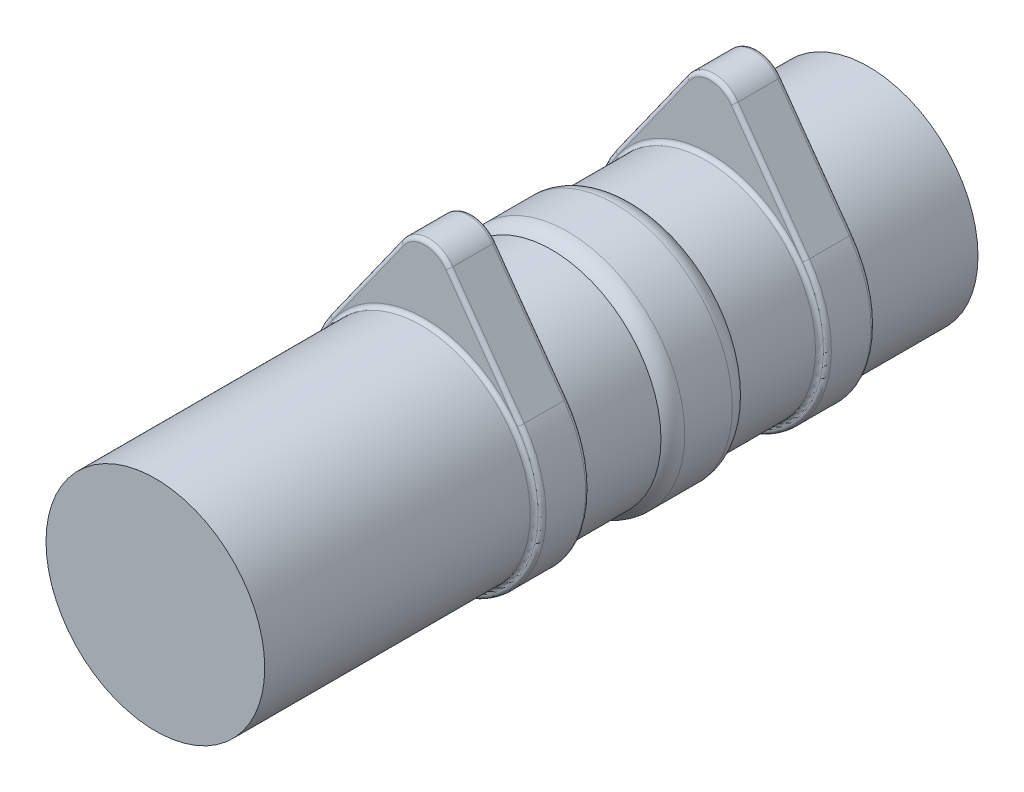
ISO-10303-21;
HEADER;
FILE_DESCRIPTION(('STEP AP214'),'2;1');
FILE_NAME('part.step','',(''),(''),'','','');
FILE_SCHEMA(('AUTOMOTIVE_DESIGN { 1 0 10303 214 1 1 1 1 }'));
ENDSEC;
DATA;
#1=APPLICATION_CONTEXT('core data for automotive mechanical design processes');
#2=APPLICATION_PROTOCOL_DEFINITION('international standard','automotive_design',2000,#1);
#3=PRODUCT_CONTEXT('',#1,'mechanical');
#4=PRODUCT('Part','Part','',(#3));
#5=PRODUCT_RELATED_PRODUCT_CATEGORY('part','',(#4));
#6=PRODUCT_DEFINITION_FORMATION('','',#4);
#7=PRODUCT_DEFINITION_CONTEXT('part definition',#1,'design');
#8=PRODUCT_DEFINITION('design','',#6,#7);
#9=PRODUCT_DEFINITION_SHAPE('','',#8);
#10=(LENGTH_UNIT() NAMED_UNIT(*) SI_UNIT(.MILLI.,.METRE.));
#11=(NAMED_UNIT(*) PLANE_ANGLE_UNIT() SI_UNIT($,.RADIAN.));
#12=(NAMED_UNIT(*) SI_UNIT($,.STERADIAN.) SOLID_ANGLE_UNIT());
#13=UNCERTAINTY_MEASURE_WITH_UNIT(LENGTH_MEASURE(1.E-05),#10,'distance_accuracy_value','');
#14=(GEOMETRIC_REPRESENTATION_CONTEXT(3) GLOBAL_UNCERTAINTY_ASSIGNED_CONTEXT((#13)) GLOBAL_UNIT_ASSIGNED_CONTEXT((#10,
#11,#12)) REPRESENTATION_CONTEXT('',''));
#15=CARTESIAN_POINT('',(0.,0.,0.));
#16=DIRECTION('',(0.,0.,1.));
#17=DIRECTION('',(1.,0.,0.));
#18=AXIS2_PLACEMENT_3D('',#15,#16,#17);
#19=CARTESIAN_POINT('',(0.,0.,-34.));
#20=DIRECTION('',(0.,0.,1.));
#21=DIRECTION('',(1.,0.,0.));
#22=AXIS2_PLACEMENT_3D('',#19,#20,#21);
#23=CYLINDRICAL_SURFACE('',#22,13.8);
#24=CARTESIAN_POINT('',(0.,0.,-33.5));
#25=DIRECTION('',(0.,0.,-1.));
#26=DIRECTION('',(-1.,0.,0.));
#27=AXIS2_PLACEMENT_3D('',#24,#25,#26);
#28=CIRCLE('',#27,13.8);
#29=CARTESIAN_POINT('',(-13.8,0.,-33.5));
#30=VERTEX_POINT('',#29);
#31=EDGE_CURVE('E261',#30,#30,#28,.F.);
#32=ORIENTED_EDGE('',*,*,#31,.T.);
#33=EDGE_LOOP('',(#32));
#34=FACE_BOUND('',#33,.T.);
#35=CARTESIAN_POINT('',(0.,0.,0.));
#36=DIRECTION('',(0.,0.,1.));
#37=DIRECTION('',(1.,0.,0.));
#38=AXIS2_PLACEMENT_3D('',#35,#36,#37);
#39=CIRCLE('',#38,13.8);
#40=CARTESIAN_POINT('',(13.8,0.,0.));
#41=VERTEX_POINT('',#40);
#42=EDGE_CURVE('E357',#41,#41,#39,.T.);
#43=ORIENTED_EDGE('',*,*,#42,.F.);
#44=EDGE_LOOP('',(#43));
#45=FACE_BOUND('',#44,.T.);
#46=ADVANCED_FACE('F39',(#34,#45),#23,.T.);
#47=CARTESIAN_POINT('',(0.,0.,0.));
#48=DIRECTION('',(0.,0.,1.));
#49=DIRECTION('',(1.,0.,0.));
#50=AXIS2_PLACEMENT_3D('',#47,#48,#49);
#51=PLANE('',#50);
#52=ORIENTED_EDGE('',*,*,#42,.T.);
#53=EDGE_LOOP('',(#52));
#54=FACE_BOUND('',#53,.T.);
#55=ADVANCED_FACE('F441',(#54),#51,.T.);
#56=CARTESIAN_POINT('',(0.,19.05,-40.));
#57=DIRECTION('',(0.,0.,1.));
#58=DIRECTION('',(1.,0.,0.));
#59=AXIS2_PLACEMENT_3D('',#56,#57,#58);
#60=CYLINDRICAL_SURFACE('',#59,3.75);
#61=DIRECTION('',(0.,0.,1.));
#62=VECTOR('',#61,1.);
#63=CARTESIAN_POINT('',(3.05467161279855,21.2251968503937,-40.));
#64=LINE('',#63,#62);
#65=CARTESIAN_POINT('',(3.05467161279855,21.2251968503937,-39.5));
#66=VERTEX_POINT('',#65);
#67=CARTESIAN_POINT('',(3.05467161279855,21.2251968503937,-34.5));
#68=VERTEX_POINT('',#67);
#69=EDGE_CURVE('E348',#66,#68,#64,.T.);
#70=ORIENTED_EDGE('',*,*,#69,.F.);
#71=CARTESIAN_POINT('',(0.,19.05,-39.5));
#72=DIRECTION('',(0.,0.,-1.));
#73=DIRECTION('',(-1.,0.,0.));
#74=AXIS2_PLACEMENT_3D('',#71,#72,#73);
#75=CIRCLE('',#74,3.75);
#76=CARTESIAN_POINT('',(-3.05467161279855,21.2251968503937,-39.5));
#77=VERTEX_POINT('',#76);
#78=EDGE_CURVE('E385',#66,#77,#75,.F.);
#79=ORIENTED_EDGE('',*,*,#78,.T.);
#80=DIRECTION('',(0.,0.,1.));
#81=VECTOR('',#80,1.);
#82=CARTESIAN_POINT('',(-3.05467161279855,21.2251968503937,-40.));
#83=LINE('',#82,#81);
#84=CARTESIAN_POINT('',(-3.05467161279855,21.2251968503937,-34.5));
#85=VERTEX_POINT('',#84);
#86=EDGE_CURVE('E337',#77,#85,#83,.T.);
#87=ORIENTED_EDGE('',*,*,#86,.T.);
#88=CARTESIAN_POINT('',(0.,19.05,-34.5));
#89=DIRECTION('',(0.,0.,-1.));
#90=DIRECTION('',(-1.,0.,0.));
#91=AXIS2_PLACEMENT_3D('',#88,#89,#90);
#92=CIRCLE('',#91,3.75);
#93=EDGE_CURVE('E382',#85,#68,#92,.T.);
#94=ORIENTED_EDGE('',*,*,#93,.T.);
#95=EDGE_LOOP('',(#70,#79,#87,#94));
#96=FACE_BOUND('',#95,.T.);
#97=ADVANCED_FACE('F419',(#96),#60,.T.);
#98=CARTESIAN_POINT('',(3.05467161279855,21.2251968503937,-40.));
#99=DIRECTION('',(-0.814579096746281,-0.58005249343832,0.));
#100=DIRECTION('',(0.58005249343832,-0.814579096746281,0.));
#101=AXIS2_PLACEMENT_3D('',#98,#99,#100);
#102=PLANE('',#101);
#103=DIRECTION('',(0.,0.,1.));
#104=VECTOR('',#103,1.);
#105=CARTESIAN_POINT('',(12.055770631845,8.58477690288714,-40.));
#106=LINE('',#105,#104);
#107=CARTESIAN_POINT('',(12.055770631845,8.58477690288714,-39.5));
#108=VERTEX_POINT('',#107);
#109=CARTESIAN_POINT('',(12.055770631845,8.58477690288714,-34.5));
#110=VERTEX_POINT('',#109);
#111=EDGE_CURVE('E344',#108,#110,#106,.T.);
#112=ORIENTED_EDGE('',*,*,#111,.F.);
#113=DIRECTION('',(0.58005249343832,-0.814579096746281,0.));
#114=VECTOR('',#113,1.);
#115=CARTESIAN_POINT('',(3.05467161279855,21.2251968503937,-39.5));
#116=LINE('',#115,#114);
#117=EDGE_CURVE('E179',#108,#66,#116,.F.);
#118=ORIENTED_EDGE('',*,*,#117,.T.);
#119=ORIENTED_EDGE('',*,*,#69,.T.);
#120=DIRECTION('',(0.58005249343832,-0.814579096746281,0.));
#121=VECTOR('',#120,1.);
#122=CARTESIAN_POINT('',(3.05467161279855,21.2251968503937,-34.5));
#123=LINE('',#122,#121);
#124=EDGE_CURVE('E327',#68,#110,#123,.T.);
#125=ORIENTED_EDGE('',*,*,#124,.T.);
#126=EDGE_LOOP('',(#112,#118,#119,#125));
#127=FACE_BOUND('',#126,.T.);
#128=ADVANCED_FACE('F421',(#127),#102,.F.);
#129=CARTESIAN_POINT('',(0.,0.,-40.));
#130=DIRECTION('',(0.,0.,1.));
#131=DIRECTION('',(1.,0.,0.));
#132=AXIS2_PLACEMENT_3D('',#129,#130,#131);
#133=CYLINDRICAL_SURFACE('',#132,14.8);
#134=DIRECTION('',(0.,0.,1.));
#135=VECTOR('',#134,1.);
#136=CARTESIAN_POINT('',(-12.055770631845,8.58477690288714,-40.));
#137=LINE('',#136,#135);
#138=CARTESIAN_POINT('',(-12.055770631845,8.58477690288714,-39.5));
#139=VERTEX_POINT('',#138);
#140=CARTESIAN_POINT('',(-12.055770631845,8.58477690288714,-34.5));
#141=VERTEX_POINT('',#140);
#142=EDGE_CURVE('E334',#139,#141,#137,.T.);
#143=ORIENTED_EDGE('',*,*,#142,.F.);
#144=CARTESIAN_POINT('',(0.,0.,-39.5));
#145=DIRECTION('',(0.,0.,-1.));
#146=DIRECTION('',(-1.,0.,0.));
#147=AXIS2_PLACEMENT_3D('',#144,#145,#146);
#148=CIRCLE('',#147,14.8);
#149=EDGE_CURVE('E321',#139,#108,#148,.F.);
#150=ORIENTED_EDGE('',*,*,#149,.T.);
#151=ORIENTED_EDGE('',*,*,#111,.T.);
#152=CARTESIAN_POINT('',(0.,0.,-34.5));
#153=DIRECTION('',(0.,0.,-1.));
#154=DIRECTION('',(-1.,0.,0.));
#155=AXIS2_PLACEMENT_3D('',#152,#153,#154);
#156=CIRCLE('',#155,14.8);
#157=EDGE_CURVE('E328',#110,#141,#156,.T.);
#158=ORIENTED_EDGE('',*,*,#157,.T.);
#159=EDGE_LOOP('',(#143,#150,#151,#158));
#160=FACE_BOUND('',#159,.T.);
#161=ADVANCED_FACE('F341',(#160),#133,.T.);
#162=CARTESIAN_POINT('',(-3.05467161279855,21.2251968503937,-40.));
#163=DIRECTION('',(0.814579096746281,-0.58005249343832,0.));
#164=DIRECTION('',(0.580052493438321,0.814579096746281,0.));
#165=AXIS2_PLACEMENT_3D('',#162,#163,#164);
#166=PLANE('',#165);
#167=ORIENTED_EDGE('',*,*,#86,.F.);
#168=DIRECTION('',(0.580052493438321,0.814579096746281,0.));
#169=VECTOR('',#168,1.);
#170=CARTESIAN_POINT('',(-12.055770631845,8.58477690288714,-39.5));
#171=LINE('',#170,#169);
#172=EDGE_CURVE('E319',#77,#139,#171,.F.);
#173=ORIENTED_EDGE('',*,*,#172,.T.);
#174=ORIENTED_EDGE('',*,*,#142,.T.);
#175=DIRECTION('',(0.580052493438321,0.814579096746281,0.));
#176=VECTOR('',#175,1.);
#177=CARTESIAN_POINT('',(-3.05467161279855,21.2251968503937,-34.5));
#178=LINE('',#177,#176);
#179=EDGE_CURVE('E339',#141,#85,#178,.T.);
#180=ORIENTED_EDGE('',*,*,#179,.T.);
#181=EDGE_LOOP('',(#167,#173,#174,#180));
#182=FACE_BOUND('',#181,.T.);
#183=ADVANCED_FACE('F333',(#182),#166,.F.);
#184=CARTESIAN_POINT('',(0.,19.05,-40.));
#185=DIRECTION('',(0.,0.,-1.));
#186=DIRECTION('',(-1.,0.,0.));
#187=AXIS2_PLACEMENT_3D('',#184,#185,#186);
#188=PLANE('',#187);
#189=DIRECTION('',(0.580052493438321,0.814579096746281,0.));
#190=VECTOR('',#189,1.);
#191=CARTESIAN_POINT('',(-2.64738206442541,20.9351706036745,-40.));
#192=LINE('',#191,#190);
#193=CARTESIAN_POINT('',(-11.6484810834718,8.29475065616799,-40.));
#194=VERTEX_POINT('',#193);
#195=CARTESIAN_POINT('',(-2.64738206442541,20.9351706036745,-40.));
#196=VERTEX_POINT('',#195);
#197=EDGE_CURVE('E165',#194,#196,#192,.T.);
#198=ORIENTED_EDGE('',*,*,#197,.T.);
#199=CARTESIAN_POINT('',(0.,19.05,-40.));
#200=DIRECTION('',(0.,0.,-1.));
#201=DIRECTION('',(-1.,0.,0.));
#202=AXIS2_PLACEMENT_3D('',#199,#200,#201);
#203=CIRCLE('',#202,3.25);
#204=CARTESIAN_POINT('',(2.64738206442541,20.9351706036745,-40.));
#205=VERTEX_POINT('',#204);
#206=EDGE_CURVE('E159',#196,#205,#203,.T.);
#207=ORIENTED_EDGE('',*,*,#206,.T.);
#208=DIRECTION('',(0.58005249343832,-0.814579096746281,0.));
#209=VECTOR('',#208,1.);
#210=CARTESIAN_POINT('',(11.6484810834718,8.29475065616797,-40.));
#211=LINE('',#210,#209);
#212=CARTESIAN_POINT('',(11.6484810834718,8.29475065616798,-40.));
#213=VERTEX_POINT('',#212);
#214=EDGE_CURVE('E152',#205,#213,#211,.T.);
#215=ORIENTED_EDGE('',*,*,#214,.T.);
#216=CARTESIAN_POINT('',(0.,0.,-40.));
#217=DIRECTION('',(0.,0.,-1.));
#218=DIRECTION('',(-1.,0.,0.));
#219=AXIS2_PLACEMENT_3D('',#216,#217,#218);
#220=CIRCLE('',#219,14.3);
#221=EDGE_CURVE('E156',#213,#194,#220,.F.);
#222=ORIENTED_EDGE('',*,*,#221,.T.);
#223=EDGE_LOOP('',(#198,#207,#215,#222));
#224=FACE_BOUND('',#223,.T.);
#225=ADVANCED_FACE('F155',(#224),#188,.T.);
#226=CARTESIAN_POINT('',(0.,19.05,-34.));
#227=DIRECTION('',(0.,0.,-1.));
#228=DIRECTION('',(-1.,0.,0.));
#229=AXIS2_PLACEMENT_3D('',#226,#227,#228);
#230=PLANE('',#229);
#231=DIRECTION('',(0.58005249343832,-0.814579096746281,0.));
#232=VECTOR('',#231,1.);
#233=CARTESIAN_POINT('',(2.64738206442541,20.9351706036745,-34.));
#234=LINE('',#233,#232);
#235=CARTESIAN_POINT('',(11.6484810834718,8.29475065616798,-34.));
#236=VERTEX_POINT('',#235);
#237=CARTESIAN_POINT('',(2.64738206442541,20.9351706036745,-34.));
#238=VERTEX_POINT('',#237);
#239=EDGE_CURVE('E398',#236,#238,#234,.F.);
#240=ORIENTED_EDGE('',*,*,#239,.T.);
#241=CARTESIAN_POINT('',(0.,19.05,-34.));
#242=DIRECTION('',(0.,0.,-1.));
#243=DIRECTION('',(-1.,0.,0.));
#244=AXIS2_PLACEMENT_3D('',#241,#242,#243);
#245=CIRCLE('',#244,3.25);
#246=CARTESIAN_POINT('',(-2.64738206442541,20.9351706036745,-34.));
#247=VERTEX_POINT('',#246);
#248=EDGE_CURVE('E269',#238,#247,#245,.F.);
#249=ORIENTED_EDGE('',*,*,#248,.T.);
#250=DIRECTION('',(0.580052493438321,0.814579096746281,0.));
#251=VECTOR('',#250,1.);
#252=CARTESIAN_POINT('',(-2.64738206442541,20.9351706036745,-34.));
#253=LINE('',#252,#251);
#254=CARTESIAN_POINT('',(-11.6484810834718,8.29475065616798,-34.));
#255=VERTEX_POINT('',#254);
#256=EDGE_CURVE('E395',#247,#255,#253,.F.);
#257=ORIENTED_EDGE('',*,*,#256,.T.);
#258=CARTESIAN_POINT('',(0.,0.,-34.));
#259=DIRECTION('',(0.,0.,-1.));
#260=DIRECTION('',(-1.,0.,0.));
#261=AXIS2_PLACEMENT_3D('',#258,#259,#260);
#262=CIRCLE('',#261,14.3);
#263=EDGE_CURVE('E392',#255,#236,#262,.T.);
#264=ORIENTED_EDGE('',*,*,#263,.T.);
#265=EDGE_LOOP('',(#240,#249,#257,#264));
#266=FACE_BOUND('',#265,.T.);
#267=ADVANCED_FACE('F405',(#266),#230,.F.);
#268=CARTESIAN_POINT('',(0.,0.,-50.));
#269=DIRECTION('',(0.,0.,1.));
#270=DIRECTION('',(1.,0.,0.));
#271=AXIS2_PLACEMENT_3D('',#268,#269,#270);
#272=CYLINDRICAL_SURFACE('',#271,13.8);
#273=CARTESIAN_POINT('',(0.,0.,-40.5));
#274=DIRECTION('',(0.,0.,-1.));
#275=DIRECTION('',(-1.,0.,0.));
#276=AXIS2_PLACEMENT_3D('',#273,#274,#275);
#277=CIRCLE('',#276,13.8);
#278=CARTESIAN_POINT('',(-13.8,0.,-40.5));
#279=VERTEX_POINT('',#278);
#280=EDGE_CURVE('E388',#279,#279,#277,.T.);
#281=ORIENTED_EDGE('',*,*,#280,.T.);
#282=EDGE_LOOP('',(#281));
#283=FACE_BOUND('',#282,.T.);
#284=CARTESIAN_POINT('',(0.,0.,-50.));
#285=DIRECTION('',(0.,0.,-1.));
#286=DIRECTION('',(-1.,0.,0.));
#287=AXIS2_PLACEMENT_3D('',#284,#285,#286);
#288=CIRCLE('',#287,13.8);
#289=CARTESIAN_POINT('',(-13.8,0.,-50.));
#290=VERTEX_POINT('',#289);
#291=EDGE_CURVE('E350',#290,#290,#288,.T.);
#292=ORIENTED_EDGE('',*,*,#291,.F.);
#293=EDGE_LOOP('',(#292));
#294=FACE_BOUND('',#293,.T.);
#295=ADVANCED_FACE('F711',(#283,#294),#272,.T.);
#296=CARTESIAN_POINT('',(0.,0.,-60.));
#297=DIRECTION('',(0.,0.,1.));
#298=DIRECTION('',(1.,0.,0.));
#299=AXIS2_PLACEMENT_3D('',#296,#297,#298);
#300=CYLINDRICAL_SURFACE('',#299,14.8);
#301=CARTESIAN_POINT('',(0.,0.,-52.));
#302=DIRECTION('',(0.,0.,1.));
#303=DIRECTION('',(1.,0.,0.));
#304=AXIS2_PLACEMENT_3D('',#301,#302,#303);
#305=CIRCLE('',#304,14.8);
#306=CARTESIAN_POINT('',(14.8,0.,-52.));
#307=VERTEX_POINT('',#306);
#308=EDGE_CURVE('E173',#307,#307,#305,.F.);
#309=ORIENTED_EDGE('',*,*,#308,.T.);
#310=EDGE_LOOP('',(#309));
#311=FACE_BOUND('',#310,.T.);
#312=CARTESIAN_POINT('',(0.,0.,-58.));
#313=DIRECTION('',(0.,0.,-1.));
#314=DIRECTION('',(-1.,0.,0.));
#315=AXIS2_PLACEMENT_3D('',#312,#313,#314);
#316=CIRCLE('',#315,14.8);
#317=CARTESIAN_POINT('',(-14.8,0.,-58.));
#318=VERTEX_POINT('',#317);
#319=EDGE_CURVE('E362',#318,#318,#316,.F.);
#320=ORIENTED_EDGE('',*,*,#319,.T.);
#321=EDGE_LOOP('',(#320));
#322=FACE_BOUND('',#321,.T.);
#323=ADVANCED_FACE('F702',(#311,#322),#300,.T.);
#324=CARTESIAN_POINT('',(0.,0.,-70.));
#325=DIRECTION('',(0.,0.,1.));
#326=DIRECTION('',(1.,0.,0.));
#327=AXIS2_PLACEMENT_3D('',#324,#325,#326);
#328=CYLINDRICAL_SURFACE('',#327,13.8);
#329=CARTESIAN_POINT('',(0.,0.,-69.5));
#330=DIRECTION('',(0.,0.,-1.));
#331=DIRECTION('',(-1.,0.,0.));
#332=AXIS2_PLACEMENT_3D('',#329,#330,#331);
#333=CIRCLE('',#332,13.8);
#334=CARTESIAN_POINT('',(-13.8,0.,-69.5));
#335=VERTEX_POINT('',#334);
#336=EDGE_CURVE('E302',#335,#335,#333,.F.);
#337=ORIENTED_EDGE('',*,*,#336,.T.);
#338=EDGE_LOOP('',(#337));
#339=FACE_BOUND('',#338,.T.);
#340=CARTESIAN_POINT('',(0.,0.,-60.));
#341=DIRECTION('',(0.,0.,-1.));
#342=DIRECTION('',(-1.,0.,0.));
#343=AXIS2_PLACEMENT_3D('',#340,#341,#342);
#344=CIRCLE('',#343,13.8);
#345=CARTESIAN_POINT('',(-13.8,0.,-60.));
#346=VERTEX_POINT('',#345);
#347=EDGE_CURVE('E361',#346,#346,#344,.T.);
#348=ORIENTED_EDGE('',*,*,#347,.T.);
#349=EDGE_LOOP('',(#348));
#350=FACE_BOUND('',#349,.T.);
#351=ADVANCED_FACE('F456',(#339,#350),#328,.T.);
#352=CARTESIAN_POINT('',(0.,0.,-52.));
#353=DIRECTION('',(0.,0.,1.));
#354=DIRECTION('',(1.,0.,0.));
#355=AXIS2_PLACEMENT_3D('',#352,#353,#354);
#356=TOROIDAL_SURFACE('',#355,12.3,2.5);
#357=ORIENTED_EDGE('',*,*,#291,.T.);
#358=EDGE_LOOP('',(#357));
#359=FACE_BOUND('',#358,.T.);
#360=ORIENTED_EDGE('',*,*,#308,.F.);
#361=EDGE_LOOP('',(#360));
#362=FACE_BOUND('',#361,.T.);
#363=ADVANCED_FACE('F452',(#359,#362),#356,.T.);
#364=CARTESIAN_POINT('',(0.,0.,-58.));
#365=DIRECTION('',(0.,0.,-1.));
#366=DIRECTION('',(-1.,0.,0.));
#367=AXIS2_PLACEMENT_3D('',#364,#365,#366);
#368=TOROIDAL_SURFACE('',#367,12.3,2.5);
#369=ORIENTED_EDGE('',*,*,#319,.F.);
#370=EDGE_LOOP('',(#369));
#371=FACE_BOUND('',#370,.T.);
#372=ORIENTED_EDGE('',*,*,#347,.F.);
#373=EDGE_LOOP('',(#372));
#374=FACE_BOUND('',#373,.T.);
#375=ADVANCED_FACE('F455',(#371,#374),#368,.T.);
#376=CARTESIAN_POINT('',(0.,19.05,-76.));
#377=DIRECTION('',(0.,0.,1.));
#378=DIRECTION('',(1.,0.,0.));
#379=AXIS2_PLACEMENT_3D('',#376,#377,#378);
#380=CYLINDRICAL_SURFACE('',#379,3.75);
#381=DIRECTION('',(0.,0.,1.));
#382=VECTOR('',#381,1.);
#383=CARTESIAN_POINT('',(-3.05467161279855,21.2251968503937,-76.));
#384=LINE('',#383,#382);
#385=CARTESIAN_POINT('',(-3.05467161279855,21.2251968503937,-75.5));
#386=VERTEX_POINT('',#385);
#387=CARTESIAN_POINT('',(-3.05467161279855,21.2251968503937,-70.5));
#388=VERTEX_POINT('',#387);
#389=EDGE_CURVE('E183',#386,#388,#384,.T.);
#390=ORIENTED_EDGE('',*,*,#389,.T.);
#391=CARTESIAN_POINT('',(0.,19.05,-70.5));
#392=DIRECTION('',(0.,0.,-1.));
#393=DIRECTION('',(-1.,0.,0.));
#394=AXIS2_PLACEMENT_3D('',#391,#392,#393);
#395=CIRCLE('',#394,3.75);
#396=CARTESIAN_POINT('',(3.05467161279855,21.2251968503937,-70.5));
#397=VERTEX_POINT('',#396);
#398=EDGE_CURVE('E299',#388,#397,#395,.T.);
#399=ORIENTED_EDGE('',*,*,#398,.T.);
#400=DIRECTION('',(0.,0.,1.));
#401=VECTOR('',#400,1.);
#402=CARTESIAN_POINT('',(3.05467161279855,21.2251968503937,-76.));
#403=LINE('',#402,#401);
#404=CARTESIAN_POINT('',(3.05467161279855,21.2251968503937,-75.5));
#405=VERTEX_POINT('',#404);
#406=EDGE_CURVE('E800',#405,#397,#403,.T.);
#407=ORIENTED_EDGE('',*,*,#406,.F.);
#408=CARTESIAN_POINT('',(0.,19.05,-75.5));
#409=DIRECTION('',(0.,0.,-1.));
#410=DIRECTION('',(-1.,0.,0.));
#411=AXIS2_PLACEMENT_3D('',#408,#409,#410);
#412=CIRCLE('',#411,3.75);
#413=EDGE_CURVE('E296',#405,#386,#412,.F.);
#414=ORIENTED_EDGE('',*,*,#413,.T.);
#415=EDGE_LOOP('',(#390,#399,#407,#414));
#416=FACE_BOUND('',#415,.T.);
#417=ADVANCED_FACE('F460',(#416),#380,.T.);
#418=CARTESIAN_POINT('',(3.05467161279855,21.2251968503937,-76.));
#419=DIRECTION('',(-0.814579096746281,-0.580052493438321,0.));
#420=DIRECTION('',(0.580052493438321,-0.814579096746281,0.));
#421=AXIS2_PLACEMENT_3D('',#418,#419,#420);
#422=PLANE('',#421);
#423=ORIENTED_EDGE('',*,*,#406,.T.);
#424=DIRECTION('',(0.580052493438321,-0.814579096746281,0.));
#425=VECTOR('',#424,1.);
#426=CARTESIAN_POINT('',(3.05467161279855,21.2251968503937,-70.5));
#427=LINE('',#426,#425);
#428=CARTESIAN_POINT('',(12.055770631845,8.58477690288715,-70.5));
#429=VERTEX_POINT('',#428);
#430=EDGE_CURVE('E260',#397,#429,#427,.T.);
#431=ORIENTED_EDGE('',*,*,#430,.T.);
#432=DIRECTION('',(0.,0.,1.));
#433=VECTOR('',#432,1.);
#434=CARTESIAN_POINT('',(12.055770631845,8.58477690288715,-76.));
#435=LINE('',#434,#433);
#436=CARTESIAN_POINT('',(12.055770631845,8.58477690288715,-75.5));
#437=VERTEX_POINT('',#436);
#438=EDGE_CURVE('E802',#437,#429,#435,.T.);
#439=ORIENTED_EDGE('',*,*,#438,.F.);
#440=DIRECTION('',(0.580052493438321,-0.814579096746281,0.));
#441=VECTOR('',#440,1.);
#442=CARTESIAN_POINT('',(3.05467161279855,21.2251968503937,-75.5));
#443=LINE('',#442,#441);
#444=EDGE_CURVE('E254',#437,#405,#443,.F.);
#445=ORIENTED_EDGE('',*,*,#444,.T.);
#446=EDGE_LOOP('',(#423,#431,#439,#445));
#447=FACE_BOUND('',#446,.T.);
#448=ADVANCED_FACE('F667',(#447),#422,.F.);
#449=CARTESIAN_POINT('',(0.,0.,-76.));
#450=DIRECTION('',(0.,0.,1.));
#451=DIRECTION('',(1.,0.,0.));
#452=AXIS2_PLACEMENT_3D('',#449,#450,#451);
#453=CYLINDRICAL_SURFACE('',#452,14.8);
#454=ORIENTED_EDGE('',*,*,#438,.T.);
#455=CARTESIAN_POINT('',(0.,0.,-70.5));
#456=DIRECTION('',(0.,0.,-1.));
#457=DIRECTION('',(-1.,0.,0.));
#458=AXIS2_PLACEMENT_3D('',#455,#456,#457);
#459=CIRCLE('',#458,14.8);
#460=CARTESIAN_POINT('',(-12.055770631845,8.58477690288715,-70.5));
#461=VERTEX_POINT('',#460);
#462=EDGE_CURVE('E287',#429,#461,#459,.T.);
#463=ORIENTED_EDGE('',*,*,#462,.T.);
#464=DIRECTION('',(0.,0.,1.));
#465=VECTOR('',#464,1.);
#466=CARTESIAN_POINT('',(-12.055770631845,8.58477690288715,-76.));
#467=LINE('',#466,#465);
#468=CARTESIAN_POINT('',(-12.055770631845,8.58477690288715,-75.5));
#469=VERTEX_POINT('',#468);
#470=EDGE_CURVE('E811',#469,#461,#467,.T.);
#471=ORIENTED_EDGE('',*,*,#470,.F.);
#472=CARTESIAN_POINT('',(0.,0.,-75.5));
#473=DIRECTION('',(0.,0.,-1.));
#474=DIRECTION('',(-1.,0.,0.));
#475=AXIS2_PLACEMENT_3D('',#472,#473,#474);
#476=CIRCLE('',#475,14.8);
#477=EDGE_CURVE('E250',#469,#437,#476,.F.);
#478=ORIENTED_EDGE('',*,*,#477,.T.);
#479=EDGE_LOOP('',(#454,#463,#471,#478));
#480=FACE_BOUND('',#479,.T.);
#481=ADVANCED_FACE('F658',(#480),#453,.T.);
#482=CARTESIAN_POINT('',(-3.05467161279855,21.2251968503937,-76.));
#483=DIRECTION('',(0.814579096746281,-0.58005249343832,0.));
#484=DIRECTION('',(0.58005249343832,0.814579096746281,0.));
#485=AXIS2_PLACEMENT_3D('',#482,#483,#484);
#486=PLANE('',#485);
#487=ORIENTED_EDGE('',*,*,#470,.T.);
#488=DIRECTION('',(0.58005249343832,0.814579096746281,0.));
#489=VECTOR('',#488,1.);
#490=CARTESIAN_POINT('',(-3.05467161279855,21.2251968503937,-70.5));
#491=LINE('',#490,#489);
#492=EDGE_CURVE('E293',#461,#388,#491,.T.);
#493=ORIENTED_EDGE('',*,*,#492,.T.);
#494=ORIENTED_EDGE('',*,*,#389,.F.);
#495=DIRECTION('',(0.58005249343832,0.814579096746281,0.));
#496=VECTOR('',#495,1.);
#497=CARTESIAN_POINT('',(-12.055770631845,8.58477690288715,-75.5));
#498=LINE('',#497,#496);
#499=EDGE_CURVE('E290',#386,#469,#498,.F.);
#500=ORIENTED_EDGE('',*,*,#499,.T.);
#501=EDGE_LOOP('',(#487,#493,#494,#500));
#502=FACE_BOUND('',#501,.T.);
#503=ADVANCED_FACE('F650',(#502),#486,.F.);
#504=CARTESIAN_POINT('',(0.,19.05,-76.));
#505=DIRECTION('',(0.,0.,-1.));
#506=DIRECTION('',(-1.,0.,0.));
#507=AXIS2_PLACEMENT_3D('',#504,#505,#506);
#508=PLANE('',#507);
#509=CARTESIAN_POINT('',(0.,0.,-76.));
#510=DIRECTION('',(0.,0.,-1.));
#511=DIRECTION('',(-1.,0.,0.));
#512=AXIS2_PLACEMENT_3D('',#509,#510,#511);
#513=CIRCLE('',#512,13.8);
#514=CARTESIAN_POINT('',(-13.8,0.,-76.));
#515=VERTEX_POINT('',#514);
#516=EDGE_CURVE('E818',#515,#515,#513,.T.);
#517=ORIENTED_EDGE('',*,*,#516,.F.);
#518=EDGE_LOOP('',(#517));
#519=FACE_BOUND('',#518,.T.);
#520=CARTESIAN_POINT('',(0.,0.,-76.));
#521=DIRECTION('',(0.,0.,-1.));
#522=DIRECTION('',(-1.,0.,0.));
#523=AXIS2_PLACEMENT_3D('',#520,#521,#522);
#524=CIRCLE('',#523,14.3);
#525=CARTESIAN_POINT('',(11.6484810834718,8.29475065616799,-76.));
#526=VERTEX_POINT('',#525);
#527=CARTESIAN_POINT('',(-11.6484810834718,8.29475065616799,-76.));
#528=VERTEX_POINT('',#527);
#529=EDGE_CURVE('E49',#526,#528,#524,.T.);
#530=ORIENTED_EDGE('',*,*,#529,.T.);
#531=DIRECTION('',(0.58005249343832,0.814579096746281,0.));
#532=VECTOR('',#531,1.);
#533=CARTESIAN_POINT('',(-2.64738206442541,20.9351706036745,-76.));
#534=LINE('',#533,#532);
#535=CARTESIAN_POINT('',(-2.64738206442541,20.9351706036745,-76.));
#536=VERTEX_POINT('',#535);
#537=EDGE_CURVE('E11',#528,#536,#534,.T.);
#538=ORIENTED_EDGE('',*,*,#537,.T.);
#539=CARTESIAN_POINT('',(0.,19.05,-76.));
#540=DIRECTION('',(0.,0.,-1.));
#541=DIRECTION('',(-1.,0.,0.));
#542=AXIS2_PLACEMENT_3D('',#539,#540,#541);
#543=CIRCLE('',#542,3.25);
#544=CARTESIAN_POINT('',(2.64738206442541,20.9351706036745,-76.));
#545=VERTEX_POINT('',#544);
#546=EDGE_CURVE('E306',#536,#545,#543,.T.);
#547=ORIENTED_EDGE('',*,*,#546,.T.);
#548=DIRECTION('',(0.580052493438321,-0.814579096746281,0.));
#549=VECTOR('',#548,1.);
#550=CARTESIAN_POINT('',(11.6484810834718,8.29475065616798,-76.));
#551=LINE('',#550,#549);
#552=EDGE_CURVE('E60',#545,#526,#551,.T.);
#553=ORIENTED_EDGE('',*,*,#552,.T.);
#554=EDGE_LOOP('',(#530,#538,#547,#553));
#555=FACE_BOUND('',#554,.T.);
#556=ADVANCED_FACE('F641',(#519,#555),#508,.T.);
#557=CARTESIAN_POINT('',(0.,19.05,-70.));
#558=DIRECTION('',(0.,0.,-1.));
#559=DIRECTION('',(-1.,0.,0.));
#560=AXIS2_PLACEMENT_3D('',#557,#558,#559);
#561=PLANE('',#560);
#562=DIRECTION('',(0.580052493438321,-0.814579096746281,0.));
#563=VECTOR('',#562,1.);
#564=CARTESIAN_POINT('',(2.64738206442541,20.9351706036745,-70.));
#565=LINE('',#564,#563);
#566=CARTESIAN_POINT('',(11.6484810834718,8.29475065616799,-70.));
#567=VERTEX_POINT('',#566);
#568=CARTESIAN_POINT('',(2.64738206442541,20.9351706036745,-70.));
#569=VERTEX_POINT('',#568);
#570=EDGE_CURVE('E278',#567,#569,#565,.F.);
#571=ORIENTED_EDGE('',*,*,#570,.T.);
#572=CARTESIAN_POINT('',(0.,19.05,-70.));
#573=DIRECTION('',(0.,0.,-1.));
#574=DIRECTION('',(-1.,0.,0.));
#575=AXIS2_PLACEMENT_3D('',#572,#573,#574);
#576=CIRCLE('',#575,3.25);
#577=CARTESIAN_POINT('',(-2.64738206442541,20.9351706036745,-70.));
#578=VERTEX_POINT('',#577);
#579=EDGE_CURVE('E282',#569,#578,#576,.F.);
#580=ORIENTED_EDGE('',*,*,#579,.T.);
#581=DIRECTION('',(0.58005249343832,0.814579096746281,0.));
#582=VECTOR('',#581,1.);
#583=CARTESIAN_POINT('',(-2.64738206442541,20.9351706036745,-70.));
#584=LINE('',#583,#582);
#585=CARTESIAN_POINT('',(-11.6484810834718,8.29475065616798,-70.));
#586=VERTEX_POINT('',#585);
#587=EDGE_CURVE('E275',#578,#586,#584,.F.);
#588=ORIENTED_EDGE('',*,*,#587,.T.);
#589=CARTESIAN_POINT('',(0.,0.,-70.));
#590=DIRECTION('',(0.,0.,-1.));
#591=DIRECTION('',(-1.,0.,0.));
#592=AXIS2_PLACEMENT_3D('',#589,#590,#591);
#593=CIRCLE('',#592,14.3);
#594=EDGE_CURVE('E266',#586,#567,#593,.T.);
#595=ORIENTED_EDGE('',*,*,#594,.T.);
#596=EDGE_LOOP('',(#571,#580,#588,#595));
#597=FACE_BOUND('',#596,.T.);
#598=ADVANCED_FACE('F474',(#597),#561,.F.);
#599=CARTESIAN_POINT('',(0.,0.,-40.5));
#600=DIRECTION('',(0.,0.,-1.));
#601=DIRECTION('',(-1.,0.,0.));
#602=AXIS2_PLACEMENT_3D('',#599,#600,#601);
#603=TOROIDAL_SURFACE('',#602,14.3,0.5);
#604=ORIENTED_EDGE('',*,*,#280,.F.);
#605=EDGE_LOOP('',(#604));
#606=FACE_BOUND('',#605,.T.);
#607=CARTESIAN_POINT('',(0.,0.,-40.));
#608=DIRECTION('',(0.,0.,-1.));
#609=DIRECTION('',(-1.,0.,0.));
#610=AXIS2_PLACEMENT_3D('',#607,#608,#609);
#611=CIRCLE('',#610,14.3);
#612=EDGE_CURVE('E170',#194,#213,#611,.F.);
#613=ORIENTED_EDGE('',*,*,#612,.F.);
#614=ORIENTED_EDGE('',*,*,#221,.F.);
#615=EDGE_LOOP('',(#613,#614));
#616=FACE_BOUND('',#615,.T.);
#617=ADVANCED_FACE('F168',(#606,#616),#603,.F.);
#618=CARTESIAN_POINT('',(2.64738206442541,20.9351706036745,-39.5));
#619=DIRECTION('',(-0.58005249343832,0.814579096746281,0.));
#620=DIRECTION('',(-0.814579096746281,-0.58005249343832,0.));
#621=AXIS2_PLACEMENT_3D('',#618,#619,#620);
#622=CYLINDRICAL_SURFACE('',#621,0.5);
#623=CARTESIAN_POINT('',(2.64738206442541,20.9351706036745,-39.5));
#624=DIRECTION('',(-0.580052493438322,0.81457909674628,0.));
#625=DIRECTION('',(-0.81457909674628,-0.580052493438322,0.));
#626=AXIS2_PLACEMENT_3D('',#623,#624,#625);
#627=CIRCLE('',#626,0.5);
#628=EDGE_CURVE('E189',#66,#205,#627,.T.);
#629=ORIENTED_EDGE('',*,*,#628,.F.);
#630=ORIENTED_EDGE('',*,*,#117,.F.);
#631=CARTESIAN_POINT('',(11.6484810834718,8.29475065616798,-39.5));
#632=DIRECTION('',(0.58005249343832,-0.814579096746281,0.));
#633=DIRECTION('',(0.814579096746281,0.580052493438321,0.));
#634=AXIS2_PLACEMENT_3D('',#631,#632,#633);
#635=CIRCLE('',#634,0.5);
#636=EDGE_CURVE('E177',#213,#108,#635,.T.);
#637=ORIENTED_EDGE('',*,*,#636,.F.);
#638=ORIENTED_EDGE('',*,*,#214,.F.);
#639=EDGE_LOOP('',(#629,#630,#637,#638));
#640=FACE_BOUND('',#639,.T.);
#641=ADVANCED_FACE('F178',(#640),#622,.T.);
#642=CARTESIAN_POINT('',(0.,0.,-39.5));
#643=DIRECTION('',(0.,0.,-1.));
#644=DIRECTION('',(-1.,0.,0.));
#645=AXIS2_PLACEMENT_3D('',#642,#643,#644);
#646=TOROIDAL_SURFACE('',#645,14.3,0.5);
#647=ORIENTED_EDGE('',*,*,#636,.T.);
#648=ORIENTED_EDGE('',*,*,#149,.F.);
#649=CARTESIAN_POINT('',(-11.6484810834718,8.29475065616798,-39.5));
#650=DIRECTION('',(0.580052493438322,0.81457909674628,0.));
#651=DIRECTION('',(-0.81457909674628,0.580052493438322,0.));
#652=AXIS2_PLACEMENT_3D('',#649,#650,#651);
#653=CIRCLE('',#652,0.5);
#654=EDGE_CURVE('E186',#194,#139,#653,.T.);
#655=ORIENTED_EDGE('',*,*,#654,.F.);
#656=ORIENTED_EDGE('',*,*,#612,.T.);
#657=EDGE_LOOP('',(#647,#648,#655,#656));
#658=FACE_BOUND('',#657,.T.);
#659=ADVANCED_FACE('F185',(#658),#646,.T.);
#660=CARTESIAN_POINT('',(0.,19.05,-39.5));
#661=DIRECTION('',(0.,0.,-1.));
#662=DIRECTION('',(-1.,0.,0.));
#663=AXIS2_PLACEMENT_3D('',#660,#661,#662);
#664=TOROIDAL_SURFACE('',#663,3.25,0.5);
#665=ORIENTED_EDGE('',*,*,#628,.T.);
#666=ORIENTED_EDGE('',*,*,#206,.F.);
#667=CARTESIAN_POINT('',(-2.64738206442541,20.9351706036745,-39.5));
#668=DIRECTION('',(-0.580052493438322,-0.81457909674628,0.));
#669=DIRECTION('',(0.81457909674628,-0.580052493438322,0.));
#670=AXIS2_PLACEMENT_3D('',#667,#668,#669);
#671=CIRCLE('',#670,0.5);
#672=EDGE_CURVE('E214',#77,#196,#671,.T.);
#673=ORIENTED_EDGE('',*,*,#672,.F.);
#674=ORIENTED_EDGE('',*,*,#78,.F.);
#675=EDGE_LOOP('',(#665,#666,#673,#674));
#676=FACE_BOUND('',#675,.T.);
#677=ADVANCED_FACE('F464',(#676),#664,.T.);
#678=CARTESIAN_POINT('',(-2.64738206442541,20.9351706036745,-39.5));
#679=DIRECTION('',(-0.580052493438321,-0.814579096746281,0.));
#680=DIRECTION('',(0.814579096746281,-0.580052493438321,0.));
#681=AXIS2_PLACEMENT_3D('',#678,#679,#680);
#682=CYLINDRICAL_SURFACE('',#681,0.5);
#683=ORIENTED_EDGE('',*,*,#654,.T.);
#684=ORIENTED_EDGE('',*,*,#172,.F.);
#685=ORIENTED_EDGE('',*,*,#672,.T.);
#686=ORIENTED_EDGE('',*,*,#197,.F.);
#687=EDGE_LOOP('',(#683,#684,#685,#686));
#688=FACE_BOUND('',#687,.T.);
#689=ADVANCED_FACE('F317',(#688),#682,.T.);
#690=CARTESIAN_POINT('',(-2.64738206442541,20.9351706036745,-34.5));
#691=DIRECTION('',(0.580052493438321,0.814579096746281,0.));
#692=DIRECTION('',(-0.814579096746281,0.580052493438321,0.));
#693=AXIS2_PLACEMENT_3D('',#690,#691,#692);
#694=CYLINDRICAL_SURFACE('',#693,0.5);
#695=CARTESIAN_POINT('',(-11.6484810834718,8.29475065616799,-34.5));
#696=DIRECTION('',(-0.58005249343832,-0.814579096746281,0.));
#697=DIRECTION('',(0.814579096746281,-0.580052493438321,0.));
#698=AXIS2_PLACEMENT_3D('',#695,#696,#697);
#699=CIRCLE('',#698,0.5);
#700=EDGE_CURVE('E206',#255,#141,#699,.T.);
#701=ORIENTED_EDGE('',*,*,#700,.F.);
#702=ORIENTED_EDGE('',*,*,#256,.F.);
#703=CARTESIAN_POINT('',(-2.64738206442541,20.9351706036745,-34.5));
#704=DIRECTION('',(0.580052493438322,0.81457909674628,0.));
#705=DIRECTION('',(-0.81457909674628,0.580052493438322,0.));
#706=AXIS2_PLACEMENT_3D('',#703,#704,#705);
#707=CIRCLE('',#706,0.5);
#708=EDGE_CURVE('E210',#85,#247,#707,.T.);
#709=ORIENTED_EDGE('',*,*,#708,.F.);
#710=ORIENTED_EDGE('',*,*,#179,.F.);
#711=EDGE_LOOP('',(#701,#702,#709,#710));
#712=FACE_BOUND('',#711,.T.);
#713=ADVANCED_FACE('F413',(#712),#694,.T.);
#714=CARTESIAN_POINT('',(0.,0.,-33.5));
#715=DIRECTION('',(0.,0.,-1.));
#716=DIRECTION('',(-1.,0.,0.));
#717=AXIS2_PLACEMENT_3D('',#714,#715,#716);
#718=TOROIDAL_SURFACE('',#717,14.3,0.5);
#719=ORIENTED_EDGE('',*,*,#31,.F.);
#720=EDGE_LOOP('',(#719));
#721=FACE_BOUND('',#720,.T.);
#722=CARTESIAN_POINT('',(0.,0.,-34.));
#723=DIRECTION('',(0.,0.,-1.));
#724=DIRECTION('',(-1.,0.,0.));
#725=AXIS2_PLACEMENT_3D('',#722,#723,#724);
#726=CIRCLE('',#725,14.3);
#727=EDGE_CURVE('E202',#236,#255,#726,.T.);
#728=ORIENTED_EDGE('',*,*,#727,.F.);
#729=ORIENTED_EDGE('',*,*,#263,.F.);
#730=EDGE_LOOP('',(#728,#729));
#731=FACE_BOUND('',#730,.T.);
#732=ADVANCED_FACE('F429',(#721,#731),#718,.F.);
#733=CARTESIAN_POINT('',(0.,19.05,-34.5));
#734=DIRECTION('',(0.,0.,-1.));
#735=DIRECTION('',(-1.,0.,0.));
#736=AXIS2_PLACEMENT_3D('',#733,#734,#735);
#737=TOROIDAL_SURFACE('',#736,3.25,0.5);
#738=ORIENTED_EDGE('',*,*,#708,.T.);
#739=ORIENTED_EDGE('',*,*,#248,.F.);
#740=CARTESIAN_POINT('',(2.64738206442541,20.9351706036745,-34.5));
#741=DIRECTION('',(0.580052493438322,-0.81457909674628,0.));
#742=DIRECTION('',(0.81457909674628,0.580052493438322,0.));
#743=AXIS2_PLACEMENT_3D('',#740,#741,#742);
#744=CIRCLE('',#743,0.5);
#745=EDGE_CURVE('E198',#68,#238,#744,.T.);
#746=ORIENTED_EDGE('',*,*,#745,.F.);
#747=ORIENTED_EDGE('',*,*,#93,.F.);
#748=EDGE_LOOP('',(#738,#739,#746,#747));
#749=FACE_BOUND('',#748,.T.);
#750=ADVANCED_FACE('F415',(#749),#737,.T.);
#751=CARTESIAN_POINT('',(0.,0.,-34.5));
#752=DIRECTION('',(0.,0.,-1.));
#753=DIRECTION('',(-1.,0.,0.));
#754=AXIS2_PLACEMENT_3D('',#751,#752,#753);
#755=TOROIDAL_SURFACE('',#754,14.3,0.5);
#756=ORIENTED_EDGE('',*,*,#700,.T.);
#757=ORIENTED_EDGE('',*,*,#157,.F.);
#758=CARTESIAN_POINT('',(11.6484810834718,8.29475065616798,-34.5));
#759=DIRECTION('',(-0.580052493438317,0.814579096746284,0.));
#760=DIRECTION('',(-0.814579096746284,-0.580052493438317,0.));
#761=AXIS2_PLACEMENT_3D('',#758,#759,#760);
#762=CIRCLE('',#761,0.5);
#763=EDGE_CURVE('E195',#236,#110,#762,.T.);
#764=ORIENTED_EDGE('',*,*,#763,.F.);
#765=ORIENTED_EDGE('',*,*,#727,.T.);
#766=EDGE_LOOP('',(#756,#757,#764,#765));
#767=FACE_BOUND('',#766,.T.);
#768=ADVANCED_FACE('F426',(#767),#755,.T.);
#769=CARTESIAN_POINT('',(2.64738206442541,20.9351706036745,-34.5));
#770=DIRECTION('',(0.58005249343832,-0.814579096746281,0.));
#771=DIRECTION('',(0.814579096746281,0.58005249343832,0.));
#772=AXIS2_PLACEMENT_3D('',#769,#770,#771);
#773=CYLINDRICAL_SURFACE('',#772,0.5);
#774=ORIENTED_EDGE('',*,*,#745,.T.);
#775=ORIENTED_EDGE('',*,*,#239,.F.);
#776=ORIENTED_EDGE('',*,*,#763,.T.);
#777=ORIENTED_EDGE('',*,*,#124,.F.);
#778=EDGE_LOOP('',(#774,#775,#776,#777));
#779=FACE_BOUND('',#778,.T.);
#780=ADVANCED_FACE('F423',(#779),#773,.T.);
#781=CARTESIAN_POINT('',(-2.64738206442541,20.9351706036745,-70.5));
#782=DIRECTION('',(0.58005249343832,0.814579096746281,0.));
#783=DIRECTION('',(-0.814579096746281,0.58005249343832,0.));
#784=AXIS2_PLACEMENT_3D('',#781,#782,#783);
#785=CYLINDRICAL_SURFACE('',#784,0.5);
#786=CARTESIAN_POINT('',(-11.6484810834718,8.29475065616798,-70.5));
#787=DIRECTION('',(-0.580052493438318,-0.814579096746283,0.));
#788=DIRECTION('',(0.814579096746283,-0.580052493438318,0.));
#789=AXIS2_PLACEMENT_3D('',#786,#787,#788);
#790=CIRCLE('',#789,0.5);
#791=EDGE_CURVE('E225',#586,#461,#790,.T.);
#792=ORIENTED_EDGE('',*,*,#791,.F.);
#793=ORIENTED_EDGE('',*,*,#587,.F.);
#794=CARTESIAN_POINT('',(-2.64738206442541,20.9351706036745,-70.5));
#795=DIRECTION('',(0.580052493438322,0.81457909674628,0.));
#796=DIRECTION('',(-0.81457909674628,0.580052493438322,0.));
#797=AXIS2_PLACEMENT_3D('',#794,#795,#796);
#798=CIRCLE('',#797,0.5);
#799=EDGE_CURVE('E199',#388,#578,#798,.T.);
#800=ORIENTED_EDGE('',*,*,#799,.F.);
#801=ORIENTED_EDGE('',*,*,#492,.F.);
#802=EDGE_LOOP('',(#792,#793,#800,#801));
#803=FACE_BOUND('',#802,.T.);
#804=ADVANCED_FACE('F478',(#803),#785,.T.);
#805=CARTESIAN_POINT('',(0.,0.,-69.5));
#806=DIRECTION('',(0.,0.,-1.));
#807=DIRECTION('',(-1.,0.,0.));
#808=AXIS2_PLACEMENT_3D('',#805,#806,#807);
#809=TOROIDAL_SURFACE('',#808,14.3,0.5);
#810=ORIENTED_EDGE('',*,*,#336,.F.);
#811=EDGE_LOOP('',(#810));
#812=FACE_BOUND('',#811,.T.);
#813=CARTESIAN_POINT('',(0.,0.,-70.));
#814=DIRECTION('',(0.,0.,-1.));
#815=DIRECTION('',(-1.,0.,0.));
#816=AXIS2_PLACEMENT_3D('',#813,#814,#815);
#817=CIRCLE('',#816,14.3);
#818=EDGE_CURVE('E221',#567,#586,#817,.T.);
#819=ORIENTED_EDGE('',*,*,#818,.F.);
#820=ORIENTED_EDGE('',*,*,#594,.F.);
#821=EDGE_LOOP('',(#819,#820));
#822=FACE_BOUND('',#821,.T.);
#823=ADVANCED_FACE('F494',(#812,#822),#809,.F.);
#824=CARTESIAN_POINT('',(0.,19.05,-70.5));
#825=DIRECTION('',(0.,0.,-1.));
#826=DIRECTION('',(-1.,0.,0.));
#827=AXIS2_PLACEMENT_3D('',#824,#825,#826);
#828=TOROIDAL_SURFACE('',#827,3.25,0.5);
#829=ORIENTED_EDGE('',*,*,#799,.T.);
#830=ORIENTED_EDGE('',*,*,#579,.F.);
#831=CARTESIAN_POINT('',(2.64738206442541,20.9351706036745,-70.5));
#832=DIRECTION('',(0.580052493438322,-0.81457909674628,0.));
#833=DIRECTION('',(0.81457909674628,0.580052493438322,0.));
#834=AXIS2_PLACEMENT_3D('',#831,#832,#833);
#835=CIRCLE('',#834,0.5);
#836=EDGE_CURVE('E218',#397,#569,#835,.T.);
#837=ORIENTED_EDGE('',*,*,#836,.F.);
#838=ORIENTED_EDGE('',*,*,#398,.F.);
#839=EDGE_LOOP('',(#829,#830,#837,#838));
#840=FACE_BOUND('',#839,.T.);
#841=ADVANCED_FACE('F502',(#840),#828,.T.);
#842=CARTESIAN_POINT('',(0.,0.,-70.5));
#843=DIRECTION('',(0.,0.,-1.));
#844=DIRECTION('',(-1.,0.,0.));
#845=AXIS2_PLACEMENT_3D('',#842,#843,#844);
#846=TOROIDAL_SURFACE('',#845,14.3,0.5);
#847=ORIENTED_EDGE('',*,*,#791,.T.);
#848=ORIENTED_EDGE('',*,*,#462,.F.);
#849=CARTESIAN_POINT('',(11.6484810834718,8.29475065616799,-70.5));
#850=DIRECTION('',(-0.580052493438322,0.81457909674628,0.));
#851=DIRECTION('',(-0.81457909674628,-0.580052493438322,0.));
#852=AXIS2_PLACEMENT_3D('',#849,#850,#851);
#853=CIRCLE('',#852,0.5);
#854=EDGE_CURVE('E215',#567,#429,#853,.T.);
#855=ORIENTED_EDGE('',*,*,#854,.F.);
#856=ORIENTED_EDGE('',*,*,#818,.T.);
#857=EDGE_LOOP('',(#847,#848,#855,#856));
#858=FACE_BOUND('',#857,.T.);
#859=ADVANCED_FACE('F510',(#858),#846,.T.);
#860=CARTESIAN_POINT('',(2.64738206442541,20.9351706036745,-70.5));
#861=DIRECTION('',(0.580052493438321,-0.814579096746281,0.));
#862=DIRECTION('',(0.814579096746281,0.580052493438321,0.));
#863=AXIS2_PLACEMENT_3D('',#860,#861,#862);
#864=CYLINDRICAL_SURFACE('',#863,0.5);
#865=ORIENTED_EDGE('',*,*,#836,.T.);
#866=ORIENTED_EDGE('',*,*,#570,.F.);
#867=ORIENTED_EDGE('',*,*,#854,.T.);
#868=ORIENTED_EDGE('',*,*,#430,.F.);
#869=EDGE_LOOP('',(#865,#866,#867,#868));
#870=FACE_BOUND('',#869,.T.);
#871=ADVANCED_FACE('F518',(#870),#864,.T.);
#872=CARTESIAN_POINT('',(2.64738206442541,20.9351706036745,-75.5));
#873=DIRECTION('',(-0.580052493438321,0.814579096746281,0.));
#874=DIRECTION('',(-0.814579096746281,-0.580052493438321,0.));
#875=AXIS2_PLACEMENT_3D('',#872,#873,#874);
#876=CYLINDRICAL_SURFACE('',#875,0.5);
#877=CARTESIAN_POINT('',(2.64738206442541,20.9351706036745,-75.5));
#878=DIRECTION('',(-0.580052493438322,0.81457909674628,0.));
#879=DIRECTION('',(-0.81457909674628,-0.580052493438322,0.));
#880=AXIS2_PLACEMENT_3D('',#877,#878,#879);
#881=CIRCLE('',#880,0.5);
#882=EDGE_CURVE('E238',#405,#545,#881,.T.);
#883=ORIENTED_EDGE('',*,*,#882,.F.);
#884=ORIENTED_EDGE('',*,*,#444,.F.);
#885=CARTESIAN_POINT('',(11.6484810834718,8.29475065616799,-75.5));
#886=DIRECTION('',(0.58005249343832,-0.814579096746281,0.));
#887=DIRECTION('',(0.814579096746281,0.580052493438321,0.));
#888=AXIS2_PLACEMENT_3D('',#885,#886,#887);
#889=CIRCLE('',#888,0.5);
#890=EDGE_CURVE('E43',#526,#437,#889,.T.);
#891=ORIENTED_EDGE('',*,*,#890,.F.);
#892=ORIENTED_EDGE('',*,*,#552,.F.);
#893=EDGE_LOOP('',(#883,#884,#891,#892));
#894=FACE_BOUND('',#893,.T.);
#895=ADVANCED_FACE('F41',(#894),#876,.T.);
#896=CARTESIAN_POINT('',(0.,0.,-75.5));
#897=DIRECTION('',(0.,0.,-1.));
#898=DIRECTION('',(-1.,0.,0.));
#899=AXIS2_PLACEMENT_3D('',#896,#897,#898);
#900=TOROIDAL_SURFACE('',#899,14.3,0.5);
#901=ORIENTED_EDGE('',*,*,#890,.T.);
#902=ORIENTED_EDGE('',*,*,#477,.F.);
#903=CARTESIAN_POINT('',(-11.6484810834718,8.29475065616799,-75.5));
#904=DIRECTION('',(0.580052493438318,0.814579096746283,0.));
#905=DIRECTION('',(-0.814579096746283,0.580052493438318,0.));
#906=AXIS2_PLACEMENT_3D('',#903,#904,#905);
#907=CIRCLE('',#906,0.5);
#908=EDGE_CURVE('E235',#528,#469,#907,.T.);
#909=ORIENTED_EDGE('',*,*,#908,.F.);
#910=ORIENTED_EDGE('',*,*,#529,.F.);
#911=EDGE_LOOP('',(#901,#902,#909,#910));
#912=FACE_BOUND('',#911,.T.);
#913=ADVANCED_FACE('F249',(#912),#900,.T.);
#914=CARTESIAN_POINT('',(0.,19.05,-75.5));
#915=DIRECTION('',(0.,0.,-1.));
#916=DIRECTION('',(-1.,0.,0.));
#917=AXIS2_PLACEMENT_3D('',#914,#915,#916);
#918=TOROIDAL_SURFACE('',#917,3.25,0.5);
#919=ORIENTED_EDGE('',*,*,#882,.T.);
#920=ORIENTED_EDGE('',*,*,#546,.F.);
#921=CARTESIAN_POINT('',(-2.64738206442541,20.9351706036745,-75.5));
#922=DIRECTION('',(-0.580052493438322,-0.81457909674628,0.));
#923=DIRECTION('',(0.81457909674628,-0.580052493438322,0.));
#924=AXIS2_PLACEMENT_3D('',#921,#922,#923);
#925=CIRCLE('',#924,0.5);
#926=EDGE_CURVE('E232',#386,#536,#925,.T.);
#927=ORIENTED_EDGE('',*,*,#926,.F.);
#928=ORIENTED_EDGE('',*,*,#413,.F.);
#929=EDGE_LOOP('',(#919,#920,#927,#928));
#930=FACE_BOUND('',#929,.T.);
#931=ADVANCED_FACE('F538',(#930),#918,.T.);
#932=CARTESIAN_POINT('',(-2.64738206442541,20.9351706036745,-75.5));
#933=DIRECTION('',(-0.58005249343832,-0.814579096746281,0.));
#934=DIRECTION('',(0.814579096746281,-0.58005249343832,0.));
#935=AXIS2_PLACEMENT_3D('',#932,#933,#934);
#936=CYLINDRICAL_SURFACE('',#935,0.5);
#937=ORIENTED_EDGE('',*,*,#908,.T.);
#938=ORIENTED_EDGE('',*,*,#499,.F.);
#939=ORIENTED_EDGE('',*,*,#926,.T.);
#940=ORIENTED_EDGE('',*,*,#537,.F.);
#941=EDGE_LOOP('',(#937,#938,#939,#940));
#942=FACE_BOUND('',#941,.T.);
#943=ADVANCED_FACE('F544',(#942),#936,.T.);
#944=CARTESIAN_POINT('',(0.,0.,-90.));
#945=DIRECTION('',(0.,0.,1.));
#946=DIRECTION('',(1.,0.,0.));
#947=AXIS2_PLACEMENT_3D('',#944,#945,#946);
#948=CYLINDRICAL_SURFACE('',#947,13.8);
#949=CARTESIAN_POINT('',(0.,0.,-90.));
#950=DIRECTION('',(0.,0.,-1.));
#951=DIRECTION('',(-1.,0.,0.));
#952=AXIS2_PLACEMENT_3D('',#949,#950,#951);
#953=CIRCLE('',#952,13.8);
#954=CARTESIAN_POINT('',(-13.8,0.,-90.));
#955=VERTEX_POINT('',#954);
#956=EDGE_CURVE('E236',#955,#955,#953,.T.);
#957=ORIENTED_EDGE('',*,*,#956,.F.);
#958=EDGE_LOOP('',(#957));
#959=FACE_BOUND('',#958,.T.);
#960=ORIENTED_EDGE('',*,*,#516,.T.);
#961=EDGE_LOOP('',(#960));
#962=FACE_BOUND('',#961,.T.);
#963=ADVANCED_FACE('F551',(#959,#962),#948,.T.);
#964=CARTESIAN_POINT('',(0.,0.,-90.));
#965=DIRECTION('',(0.,0.,-1.));
#966=DIRECTION('',(-1.,0.,0.));
#967=AXIS2_PLACEMENT_3D('',#964,#965,#966);
#968=PLANE('',#967);
#969=ORIENTED_EDGE('',*,*,#956,.T.);
#970=EDGE_LOOP('',(#969));
#971=FACE_BOUND('',#970,.T.);
#972=ADVANCED_FACE('F560',(#971),#968,.T.);
#973=CLOSED_SHELL('',(#46,#55,#97,#128,#161,#183,#225,#267,#295,#323,#351,#363,#375,#417,#448,
#481,#503,#556,#598,#617,#641,#659,#677,#689,#713,#732,#750,#768,#780,#804,#823,#841,#859,#871,
#895,#913,#931,#943,#963,#972));
#974=MANIFOLD_SOLID_BREP('B2',#973);
#975=ADVANCED_BREP_SHAPE_REPRESENTATION('',(#18,#974),#14);
#976=SHAPE_DEFINITION_REPRESENTATION(#9,#975);
ENDSEC;
END-ISO-10303-21;
